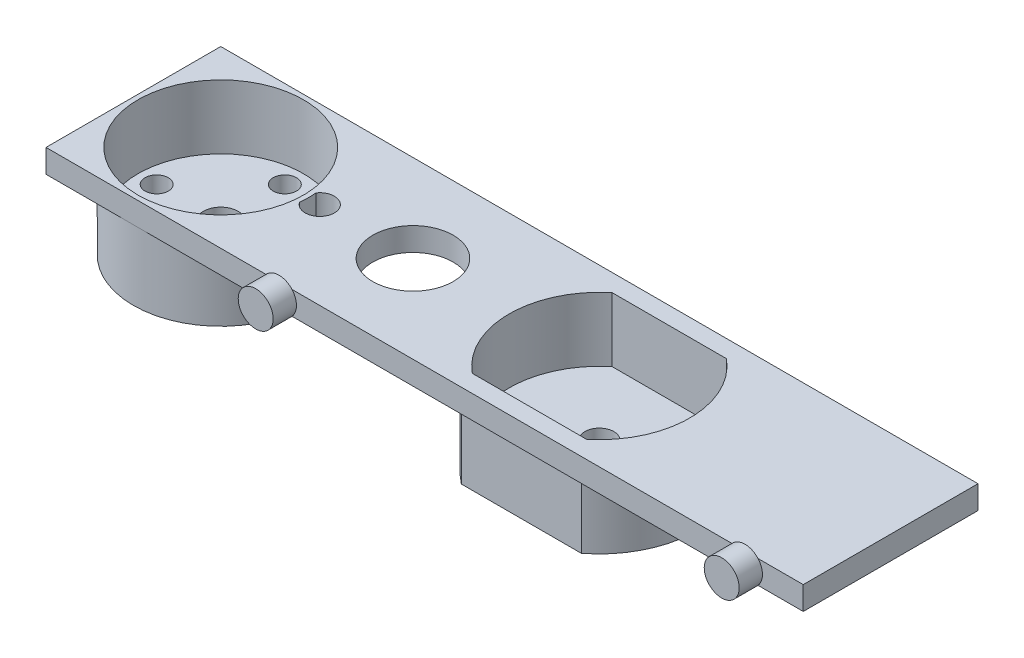
ISO-10303-21;
HEADER;
FILE_DESCRIPTION(('STEP AP214'),'2;1');
FILE_NAME('part.step','',(''),(''),'','','');
FILE_SCHEMA(('AUTOMOTIVE_DESIGN { 1 0 10303 214 1 1 1 1 }'));
ENDSEC;
DATA;
#1=APPLICATION_CONTEXT('core data for automotive mechanical design processes');
#2=APPLICATION_PROTOCOL_DEFINITION('international standard','automotive_design',2000,#1);
#3=PRODUCT_CONTEXT('',#1,'mechanical');
#4=PRODUCT('Part','Part','',(#3));
#5=PRODUCT_RELATED_PRODUCT_CATEGORY('part','',(#4));
#6=PRODUCT_DEFINITION_FORMATION('','',#4);
#7=PRODUCT_DEFINITION_CONTEXT('part definition',#1,'design');
#8=PRODUCT_DEFINITION('design','',#6,#7);
#9=PRODUCT_DEFINITION_SHAPE('','',#8);
#10=(LENGTH_UNIT() NAMED_UNIT(*) SI_UNIT(.MILLI.,.METRE.));
#11=(NAMED_UNIT(*) PLANE_ANGLE_UNIT() SI_UNIT($,.RADIAN.));
#12=(NAMED_UNIT(*) SI_UNIT($,.STERADIAN.) SOLID_ANGLE_UNIT());
#13=UNCERTAINTY_MEASURE_WITH_UNIT(LENGTH_MEASURE(1.E-05),#10,'distance_accuracy_value','');
#14=(GEOMETRIC_REPRESENTATION_CONTEXT(3) GLOBAL_UNCERTAINTY_ASSIGNED_CONTEXT((#13)) GLOBAL_UNIT_ASSIGNED_CONTEXT((#10,
#11,#12)) REPRESENTATION_CONTEXT('',''));
#15=CARTESIAN_POINT('',(0.,0.,0.));
#16=DIRECTION('',(0.,0.,1.));
#17=DIRECTION('',(1.,0.,0.));
#18=AXIS2_PLACEMENT_3D('',#15,#16,#17);
#19=CARTESIAN_POINT('',(0.,2.,0.));
#20=DIRECTION('',(0.,1.,0.));
#21=DIRECTION('',(0.,0.,1.));
#22=AXIS2_PLACEMENT_3D('',#19,#20,#21);
#23=PLANE('',#22);
#24=CARTESIAN_POINT('',(-24.,2.,0.));
#25=DIRECTION('',(0.,1.,0.));
#26=DIRECTION('',(0.,0.,1.));
#27=AXIS2_PLACEMENT_3D('',#24,#25,#26);
#28=CIRCLE('',#27,1.25);
#29=CARTESIAN_POINT('',(-25.0330882352941,2.,-0.703724873865407));
#30=VERTEX_POINT('',#29);
#31=CARTESIAN_POINT('',(-25.0330882352941,2.,0.703724873865419));
#32=VERTEX_POINT('',#31);
#33=EDGE_CURVE('E427',#30,#32,#28,.F.);
#34=ORIENTED_EDGE('',*,*,#33,.T.);
#35=CARTESIAN_POINT('',(-32.5,2.,0.));
#36=DIRECTION('',(0.,1.,0.));
#37=DIRECTION('',(0.,0.,1.));
#38=AXIS2_PLACEMENT_3D('',#35,#36,#37);
#39=CIRCLE('',#38,7.5);
#40=EDGE_CURVE('E354',#32,#30,#39,.T.);
#41=ORIENTED_EDGE('',*,*,#40,.T.);
#42=EDGE_LOOP('',(#34,#41));
#43=FACE_BOUND('',#42,.T.);
#44=DIRECTION('',(0.,0.,-1.));
#45=VECTOR('',#44,1.);
#46=CARTESIAN_POINT('',(-40.,2.,0.));
#47=LINE('',#46,#45);
#48=CARTESIAN_POINT('',(-40.,2.,7.5));
#49=VERTEX_POINT('',#48);
#50=CARTESIAN_POINT('',(-40.,2.,-7.5));
#51=VERTEX_POINT('',#50);
#52=EDGE_CURVE('E443',#49,#51,#47,.T.);
#53=ORIENTED_EDGE('',*,*,#52,.F.);
#54=DIRECTION('',(-1.,0.,0.));
#55=VECTOR('',#54,1.);
#56=CARTESIAN_POINT('',(0.,2.,7.5));
#57=LINE('',#56,#55);
#58=CARTESIAN_POINT('',(-21.1180339887499,2.,7.5));
#59=VERTEX_POINT('',#58);
#60=EDGE_CURVE('E447',#59,#49,#57,.T.);
#61=ORIENTED_EDGE('',*,*,#60,.F.);
#62=CARTESIAN_POINT('',(-18.8819660112501,2.,7.5));
#63=VERTEX_POINT('',#62);
#64=EDGE_CURVE('E714',#63,#59,#57,.T.);
#65=ORIENTED_EDGE('',*,*,#64,.F.);
#66=CARTESIAN_POINT('',(18.8819660112501,2.,7.5));
#67=VERTEX_POINT('',#66);
#68=EDGE_CURVE('E710',#67,#63,#57,.T.);
#69=ORIENTED_EDGE('',*,*,#68,.F.);
#70=CARTESIAN_POINT('',(21.1180339887499,2.,7.5));
#71=VERTEX_POINT('',#70);
#72=EDGE_CURVE('E453',#71,#67,#57,.T.);
#73=ORIENTED_EDGE('',*,*,#72,.F.);
#74=CARTESIAN_POINT('',(25.,2.,7.5));
#75=VERTEX_POINT('',#74);
#76=EDGE_CURVE('E449',#75,#71,#57,.T.);
#77=ORIENTED_EDGE('',*,*,#76,.F.);
#78=DIRECTION('',(0.,0.,1.));
#79=VECTOR('',#78,1.);
#80=CARTESIAN_POINT('',(25.,2.,-7.5));
#81=LINE('',#80,#79);
#82=CARTESIAN_POINT('',(25.,2.,-7.5));
#83=VERTEX_POINT('',#82);
#84=EDGE_CURVE('E479',#83,#75,#81,.T.);
#85=ORIENTED_EDGE('',*,*,#84,.F.);
#86=DIRECTION('',(-1.,0.,0.));
#87=VECTOR('',#86,1.);
#88=CARTESIAN_POINT('',(0.,2.,-7.5));
#89=LINE('',#88,#87);
#90=EDGE_CURVE('E452',#83,#51,#89,.T.);
#91=ORIENTED_EDGE('',*,*,#90,.T.);
#92=EDGE_LOOP('',(#53,#61,#65,#69,#73,#77,#85,#91));
#93=FACE_BOUND('',#92,.T.);
#94=CARTESIAN_POINT('',(-16.,2.,0.));
#95=DIRECTION('',(0.,1.,0.));
#96=DIRECTION('',(0.,0.,1.));
#97=AXIS2_PLACEMENT_3D('',#94,#95,#96);
#98=CIRCLE('',#97,3.45);
#99=CARTESIAN_POINT('',(-16.,2.,3.45));
#100=VERTEX_POINT('',#99);
#101=EDGE_CURVE('E411',#100,#100,#98,.F.);
#102=ORIENTED_EDGE('',*,*,#101,.T.);
#103=EDGE_LOOP('',(#102));
#104=FACE_BOUND('',#103,.T.);
#105=CARTESIAN_POINT('',(-32.5,2.,0.));
#106=DIRECTION('',(0.,1.,0.));
#107=DIRECTION('',(0.,0.,1.));
#108=AXIS2_PLACEMENT_3D('',#105,#106,#107);
#109=CIRCLE('',#108,7.1);
#110=CARTESIAN_POINT('',(-32.5,2.,7.1));
#111=VERTEX_POINT('',#110);
#112=EDGE_CURVE('E266',#111,#111,#109,.T.);
#113=ORIENTED_EDGE('',*,*,#112,.F.);
#114=EDGE_LOOP('',(#113));
#115=FACE_BOUND('',#114,.T.);
#116=CARTESIAN_POINT('',(0.,2.,0.));
#117=DIRECTION('',(0.,1.,0.));
#118=DIRECTION('',(0.,0.,1.));
#119=AXIS2_PLACEMENT_3D('',#116,#117,#118);
#120=CIRCLE('',#119,7.75);
#121=CARTESIAN_POINT('',(4.90535421758714,2.,6.));
#122=VERTEX_POINT('',#121);
#123=CARTESIAN_POINT('',(4.90535421758714,2.,-6.));
#124=VERTEX_POINT('',#123);
#125=EDGE_CURVE('E293',#122,#124,#120,.T.);
#126=ORIENTED_EDGE('',*,*,#125,.F.);
#127=DIRECTION('',(-1.,0.,0.));
#128=VECTOR('',#127,1.);
#129=CARTESIAN_POINT('',(0.,2.,6.));
#130=LINE('',#129,#128);
#131=CARTESIAN_POINT('',(-4.90535421758714,2.,6.));
#132=VERTEX_POINT('',#131);
#133=EDGE_CURVE('E138',#122,#132,#130,.T.);
#134=ORIENTED_EDGE('',*,*,#133,.T.);
#135=CARTESIAN_POINT('',(0.,2.,0.));
#136=DIRECTION('',(0.,1.,0.));
#137=DIRECTION('',(0.,0.,1.));
#138=AXIS2_PLACEMENT_3D('',#135,#136,#137);
#139=CIRCLE('',#138,7.75);
#140=CARTESIAN_POINT('',(-4.90535421758714,2.,-6.));
#141=VERTEX_POINT('',#140);
#142=EDGE_CURVE('E279',#141,#132,#139,.T.);
#143=ORIENTED_EDGE('',*,*,#142,.F.);
#144=DIRECTION('',(-1.,0.,0.));
#145=VECTOR('',#144,1.);
#146=CARTESIAN_POINT('',(0.,2.,-6.));
#147=LINE('',#146,#145);
#148=EDGE_CURVE('E573',#124,#141,#147,.T.);
#149=ORIENTED_EDGE('',*,*,#148,.F.);
#150=EDGE_LOOP('',(#126,#134,#143,#149));
#151=FACE_BOUND('',#150,.T.);
#152=ADVANCED_FACE('F121',(#43,#93,#104,#115,#151),#23,.T.);
#153=CARTESIAN_POINT('',(-38.,11.7580735803744,0.));
#154=DIRECTION('',(0.,-1.,0.));
#155=DIRECTION('',(0.,0.,-1.));
#156=AXIS2_PLACEMENT_3D('',#153,#154,#155);
#157=CYLINDRICAL_SURFACE('',#156,0.999999999999991);
#158=CARTESIAN_POINT('',(-38.,-6.,0.));
#159=DIRECTION('',(0.,1.,0.));
#160=DIRECTION('',(0.,0.,1.));
#161=AXIS2_PLACEMENT_3D('',#158,#159,#160);
#162=CIRCLE('',#161,0.999999999999991);
#163=CARTESIAN_POINT('',(-38.,-6.,0.999999999999992));
#164=VERTEX_POINT('',#163);
#165=EDGE_CURVE('E342',#164,#164,#162,.T.);
#166=ORIENTED_EDGE('',*,*,#165,.F.);
#167=EDGE_LOOP('',(#166));
#168=FACE_BOUND('',#167,.T.);
#169=CARTESIAN_POINT('',(-38.,-3.5,0.));
#170=DIRECTION('',(0.,1.,0.));
#171=DIRECTION('',(0.,0.,1.));
#172=AXIS2_PLACEMENT_3D('',#169,#170,#171);
#173=CIRCLE('',#172,0.999999999999991);
#174=CARTESIAN_POINT('',(-38.,-3.5,0.999999999999992));
#175=VERTEX_POINT('',#174);
#176=EDGE_CURVE('E320',#175,#175,#173,.T.);
#177=ORIENTED_EDGE('',*,*,#176,.T.);
#178=EDGE_LOOP('',(#177));
#179=FACE_BOUND('',#178,.T.);
#180=ADVANCED_FACE('F562',(#168,#179),#157,.F.);
#181=CARTESIAN_POINT('',(-32.5,11.7580735803744,0.));
#182=DIRECTION('',(0.,-1.,0.));
#183=DIRECTION('',(0.,0.,-1.));
#184=AXIS2_PLACEMENT_3D('',#181,#182,#183);
#185=CYLINDRICAL_SURFACE('',#184,1.5);
#186=CARTESIAN_POINT('',(-32.5,-6.,0.));
#187=DIRECTION('',(0.,1.,0.));
#188=DIRECTION('',(0.,0.,1.));
#189=AXIS2_PLACEMENT_3D('',#186,#187,#188);
#190=CIRCLE('',#189,1.5);
#191=CARTESIAN_POINT('',(-32.5,-6.,1.50000000000001));
#192=VERTEX_POINT('',#191);
#193=EDGE_CURVE('E338',#192,#192,#190,.T.);
#194=ORIENTED_EDGE('',*,*,#193,.F.);
#195=EDGE_LOOP('',(#194));
#196=FACE_BOUND('',#195,.T.);
#197=CARTESIAN_POINT('',(-32.5,-3.5,0.));
#198=DIRECTION('',(0.,1.,0.));
#199=DIRECTION('',(0.,0.,1.));
#200=AXIS2_PLACEMENT_3D('',#197,#198,#199);
#201=CIRCLE('',#200,1.5);
#202=CARTESIAN_POINT('',(-32.5,-3.5,1.50000000000001));
#203=VERTEX_POINT('',#202);
#204=EDGE_CURVE('E316',#203,#203,#201,.T.);
#205=ORIENTED_EDGE('',*,*,#204,.T.);
#206=EDGE_LOOP('',(#205));
#207=FACE_BOUND('',#206,.T.);
#208=ADVANCED_FACE('F665',(#196,#207),#185,.F.);
#209=CARTESIAN_POINT('',(-32.5,11.7580735803744,5.5));
#210=DIRECTION('',(0.,-1.,0.));
#211=DIRECTION('',(0.,0.,-1.));
#212=AXIS2_PLACEMENT_3D('',#209,#210,#211);
#213=CYLINDRICAL_SURFACE('',#212,0.999999999999998);
#214=CARTESIAN_POINT('',(-32.5,-6.,5.5));
#215=DIRECTION('',(0.,1.,0.));
#216=DIRECTION('',(0.,0.,1.));
#217=AXIS2_PLACEMENT_3D('',#214,#215,#216);
#218=CIRCLE('',#217,0.999999999999998);
#219=CARTESIAN_POINT('',(-32.5,-6.,6.5));
#220=VERTEX_POINT('',#219);
#221=EDGE_CURVE('E324',#220,#220,#218,.T.);
#222=ORIENTED_EDGE('',*,*,#221,.F.);
#223=EDGE_LOOP('',(#222));
#224=FACE_BOUND('',#223,.T.);
#225=CARTESIAN_POINT('',(-32.5,-3.5,5.5));
#226=DIRECTION('',(0.,1.,0.));
#227=DIRECTION('',(0.,0.,1.));
#228=AXIS2_PLACEMENT_3D('',#225,#226,#227);
#229=CIRCLE('',#228,0.999999999999998);
#230=CARTESIAN_POINT('',(-32.5,-3.5,6.5));
#231=VERTEX_POINT('',#230);
#232=EDGE_CURVE('E312',#231,#231,#229,.T.);
#233=ORIENTED_EDGE('',*,*,#232,.T.);
#234=EDGE_LOOP('',(#233));
#235=FACE_BOUND('',#234,.T.);
#236=ADVANCED_FACE('F661',(#224,#235),#213,.F.);
#237=CARTESIAN_POINT('',(-27.,11.7580735803744,0.));
#238=DIRECTION('',(0.,-1.,0.));
#239=DIRECTION('',(0.,0.,-1.));
#240=AXIS2_PLACEMENT_3D('',#237,#238,#239);
#241=CYLINDRICAL_SURFACE('',#240,0.999999999999998);
#242=CARTESIAN_POINT('',(-27.,-6.,0.));
#243=DIRECTION('',(0.,1.,0.));
#244=DIRECTION('',(0.,0.,1.));
#245=AXIS2_PLACEMENT_3D('',#242,#243,#244);
#246=CIRCLE('',#245,0.999999999999998);
#247=CARTESIAN_POINT('',(-27.,-6.,0.999999999999999));
#248=VERTEX_POINT('',#247);
#249=EDGE_CURVE('E334',#248,#248,#246,.T.);
#250=ORIENTED_EDGE('',*,*,#249,.F.);
#251=EDGE_LOOP('',(#250));
#252=FACE_BOUND('',#251,.T.);
#253=CARTESIAN_POINT('',(-27.,-3.5,0.));
#254=DIRECTION('',(0.,1.,0.));
#255=DIRECTION('',(0.,0.,1.));
#256=AXIS2_PLACEMENT_3D('',#253,#254,#255);
#257=CIRCLE('',#256,0.999999999999998);
#258=CARTESIAN_POINT('',(-27.,-3.5,0.999999999999999));
#259=VERTEX_POINT('',#258);
#260=EDGE_CURVE('E308',#259,#259,#257,.T.);
#261=ORIENTED_EDGE('',*,*,#260,.T.);
#262=EDGE_LOOP('',(#261));
#263=FACE_BOUND('',#262,.T.);
#264=ADVANCED_FACE('F664',(#252,#263),#241,.F.);
#265=CARTESIAN_POINT('',(-32.5,11.7580735803744,-5.5));
#266=DIRECTION('',(0.,-1.,0.));
#267=DIRECTION('',(0.,0.,-1.));
#268=AXIS2_PLACEMENT_3D('',#265,#266,#267);
#269=CYLINDRICAL_SURFACE('',#268,0.999999999999991);
#270=CARTESIAN_POINT('',(-32.5,-6.,-5.5));
#271=DIRECTION('',(0.,1.,0.));
#272=DIRECTION('',(0.,0.,1.));
#273=AXIS2_PLACEMENT_3D('',#270,#271,#272);
#274=CIRCLE('',#273,0.999999999999991);
#275=CARTESIAN_POINT('',(-32.5,-6.,-4.50000000000001));
#276=VERTEX_POINT('',#275);
#277=EDGE_CURVE('E330',#276,#276,#274,.T.);
#278=ORIENTED_EDGE('',*,*,#277,.F.);
#279=EDGE_LOOP('',(#278));
#280=FACE_BOUND('',#279,.T.);
#281=CARTESIAN_POINT('',(-32.5,-3.5,-5.5));
#282=DIRECTION('',(0.,1.,0.));
#283=DIRECTION('',(0.,0.,1.));
#284=AXIS2_PLACEMENT_3D('',#281,#282,#283);
#285=CIRCLE('',#284,0.999999999999991);
#286=CARTESIAN_POINT('',(-32.5,-3.5,-4.50000000000001));
#287=VERTEX_POINT('',#286);
#288=EDGE_CURVE('E125',#287,#287,#285,.T.);
#289=ORIENTED_EDGE('',*,*,#288,.T.);
#290=EDGE_LOOP('',(#289));
#291=FACE_BOUND('',#290,.T.);
#292=ADVANCED_FACE('F587',(#280,#291),#269,.F.);
#293=CARTESIAN_POINT('',(0.,11.7580735803744,0.));
#294=DIRECTION('',(0.,-1.,0.));
#295=DIRECTION('',(0.,0.,-1.));
#296=AXIS2_PLACEMENT_3D('',#293,#294,#295);
#297=CYLINDRICAL_SURFACE('',#296,1.25);
#298=CARTESIAN_POINT('',(0.,-6.,0.));
#299=DIRECTION('',(0.,1.,0.));
#300=DIRECTION('',(0.,0.,1.));
#301=AXIS2_PLACEMENT_3D('',#298,#299,#300);
#302=CIRCLE('',#301,1.25);
#303=CARTESIAN_POINT('',(0.,-6.,1.25));
#304=VERTEX_POINT('',#303);
#305=EDGE_CURVE('E325',#304,#304,#302,.T.);
#306=ORIENTED_EDGE('',*,*,#305,.F.);
#307=EDGE_LOOP('',(#306));
#308=FACE_BOUND('',#307,.T.);
#309=CARTESIAN_POINT('',(0.,-3.5,0.));
#310=DIRECTION('',(0.,1.,0.));
#311=DIRECTION('',(0.,0.,1.));
#312=AXIS2_PLACEMENT_3D('',#309,#310,#311);
#313=CIRCLE('',#312,1.25);
#314=CARTESIAN_POINT('',(0.,-3.5,1.25));
#315=VERTEX_POINT('',#314);
#316=EDGE_CURVE('E275',#315,#315,#313,.T.);
#317=ORIENTED_EDGE('',*,*,#316,.T.);
#318=EDGE_LOOP('',(#317));
#319=FACE_BOUND('',#318,.T.);
#320=ADVANCED_FACE('F657',(#308,#319),#297,.F.);
#321=CARTESIAN_POINT('',(0.,0.,0.));
#322=DIRECTION('',(0.,1.,0.));
#323=DIRECTION('',(0.,0.,1.));
#324=AXIS2_PLACEMENT_3D('',#321,#322,#323);
#325=PLANE('',#324);
#326=DIRECTION('',(1.,0.,0.));
#327=VECTOR('',#326,1.);
#328=CARTESIAN_POINT('',(0.,0.,6.7));
#329=LINE('',#328,#327);
#330=CARTESIAN_POINT('',(-5.14902903468217,0.,6.7));
#331=VERTEX_POINT('',#330);
#332=CARTESIAN_POINT('',(5.14902903468217,0.,6.7));
#333=VERTEX_POINT('',#332);
#334=EDGE_CURVE('E398',#331,#333,#329,.T.);
#335=ORIENTED_EDGE('',*,*,#334,.T.);
#336=CARTESIAN_POINT('',(0.,0.,0.));
#337=DIRECTION('',(0.,1.,0.));
#338=DIRECTION('',(0.,0.,1.));
#339=AXIS2_PLACEMENT_3D('',#336,#337,#338);
#340=CIRCLE('',#339,8.45);
#341=CARTESIAN_POINT('',(5.14902903468217,0.,-6.7));
#342=VERTEX_POINT('',#341);
#343=EDGE_CURVE('E402',#333,#342,#340,.T.);
#344=ORIENTED_EDGE('',*,*,#343,.T.);
#345=DIRECTION('',(-1.,0.,0.));
#346=VECTOR('',#345,1.);
#347=CARTESIAN_POINT('',(0.,0.,-6.7));
#348=LINE('',#347,#346);
#349=CARTESIAN_POINT('',(-5.14902903468217,0.,-6.7));
#350=VERTEX_POINT('',#349);
#351=EDGE_CURVE('E390',#342,#350,#348,.T.);
#352=ORIENTED_EDGE('',*,*,#351,.T.);
#353=CARTESIAN_POINT('',(0.,0.,0.));
#354=DIRECTION('',(0.,1.,0.));
#355=DIRECTION('',(0.,0.,1.));
#356=AXIS2_PLACEMENT_3D('',#353,#354,#355);
#357=CIRCLE('',#356,8.45);
#358=EDGE_CURVE('E394',#350,#331,#357,.T.);
#359=ORIENTED_EDGE('',*,*,#358,.T.);
#360=EDGE_LOOP('',(#335,#344,#352,#359));
#361=FACE_BOUND('',#360,.T.);
#362=CARTESIAN_POINT('',(-16.,0.,0.));
#363=DIRECTION('',(0.,-1.,0.));
#364=DIRECTION('',(0.,0.,-1.));
#365=AXIS2_PLACEMENT_3D('',#362,#363,#364);
#366=CIRCLE('',#365,3.45);
#367=CARTESIAN_POINT('',(-16.,0.,-3.45));
#368=VERTEX_POINT('',#367);
#369=EDGE_CURVE('E432',#368,#368,#366,.T.);
#370=ORIENTED_EDGE('',*,*,#369,.F.);
#371=EDGE_LOOP('',(#370));
#372=FACE_BOUND('',#371,.T.);
#373=DIRECTION('',(-1.,0.,0.));
#374=VECTOR('',#373,1.);
#375=CARTESIAN_POINT('',(0.,0.,7.5));
#376=LINE('',#375,#374);
#377=CARTESIAN_POINT('',(-21.1180339887499,0.,7.5));
#378=VERTEX_POINT('',#377);
#379=CARTESIAN_POINT('',(-32.5,0.,7.5));
#380=VERTEX_POINT('',#379);
#381=EDGE_CURVE('E523',#378,#380,#376,.T.);
#382=ORIENTED_EDGE('',*,*,#381,.T.);
#383=CARTESIAN_POINT('',(-32.5,0.,0.));
#384=DIRECTION('',(0.,1.,0.));
#385=DIRECTION('',(0.,0.,1.));
#386=AXIS2_PLACEMENT_3D('',#383,#384,#385);
#387=CIRCLE('',#386,7.5);
#388=CARTESIAN_POINT('',(-25.0330882352941,0.,0.703724873865416));
#389=VERTEX_POINT('',#388);
#390=EDGE_CURVE('E353',#380,#389,#387,.T.);
#391=ORIENTED_EDGE('',*,*,#390,.T.);
#392=CARTESIAN_POINT('',(-24.,0.,0.));
#393=DIRECTION('',(0.,-1.,0.));
#394=DIRECTION('',(0.,0.,-1.));
#395=AXIS2_PLACEMENT_3D('',#392,#393,#394);
#396=CIRCLE('',#395,1.25);
#397=CARTESIAN_POINT('',(-25.0330882352941,0.,-0.703724873865404));
#398=VERTEX_POINT('',#397);
#399=EDGE_CURVE('E431',#398,#389,#396,.T.);
#400=ORIENTED_EDGE('',*,*,#399,.F.);
#401=CARTESIAN_POINT('',(-32.5,0.,-7.5));
#402=VERTEX_POINT('',#401);
#403=EDGE_CURVE('E388',#398,#402,#387,.T.);
#404=ORIENTED_EDGE('',*,*,#403,.T.);
#405=DIRECTION('',(-1.,0.,0.));
#406=VECTOR('',#405,1.);
#407=CARTESIAN_POINT('',(0.,0.,-7.5));
#408=LINE('',#407,#406);
#409=CARTESIAN_POINT('',(25.,0.,-7.5));
#410=VERTEX_POINT('',#409);
#411=EDGE_CURVE('E448',#410,#402,#408,.T.);
#412=ORIENTED_EDGE('',*,*,#411,.F.);
#413=DIRECTION('',(0.,0.,1.));
#414=VECTOR('',#413,1.);
#415=CARTESIAN_POINT('',(25.,0.,-7.5));
#416=LINE('',#415,#414);
#417=CARTESIAN_POINT('',(25.,0.,7.5));
#418=VERTEX_POINT('',#417);
#419=EDGE_CURVE('E436',#410,#418,#416,.T.);
#420=ORIENTED_EDGE('',*,*,#419,.T.);
#421=CARTESIAN_POINT('',(21.1180339887499,0.,7.5));
#422=VERTEX_POINT('',#421);
#423=EDGE_CURVE('E463',#418,#422,#376,.T.);
#424=ORIENTED_EDGE('',*,*,#423,.T.);
#425=CARTESIAN_POINT('',(18.8819660112501,0.,7.5));
#426=VERTEX_POINT('',#425);
#427=EDGE_CURVE('E468',#422,#426,#376,.T.);
#428=ORIENTED_EDGE('',*,*,#427,.T.);
#429=CARTESIAN_POINT('',(-18.8819660112501,0.,7.5));
#430=VERTEX_POINT('',#429);
#431=EDGE_CURVE('E517',#426,#430,#376,.T.);
#432=ORIENTED_EDGE('',*,*,#431,.T.);
#433=EDGE_CURVE('E519',#430,#378,#376,.T.);
#434=ORIENTED_EDGE('',*,*,#433,.T.);
#435=EDGE_LOOP('',(#382,#391,#400,#404,#412,#420,#424,#428,#432,#434));
#436=FACE_BOUND('',#435,.T.);
#437=ADVANCED_FACE('F555',(#361,#372,#436),#325,.F.);
#438=CARTESIAN_POINT('',(-40.,0.,-7.5));
#439=VERTEX_POINT('',#438);
#440=EDGE_CURVE('E467',#402,#439,#408,.T.);
#441=ORIENTED_EDGE('',*,*,#440,.F.);
#442=CARTESIAN_POINT('',(-40.,0.,0.));
#443=VERTEX_POINT('',#442);
#444=EDGE_CURVE('E389',#402,#443,#387,.T.);
#445=ORIENTED_EDGE('',*,*,#444,.T.);
#446=DIRECTION('',(0.,0.,-1.));
#447=VECTOR('',#446,1.);
#448=CARTESIAN_POINT('',(-40.,0.,0.));
#449=LINE('',#448,#447);
#450=EDGE_CURVE('E462',#443,#439,#449,.T.);
#451=ORIENTED_EDGE('',*,*,#450,.T.);
#452=EDGE_LOOP('',(#441,#445,#451));
#453=FACE_BOUND('',#452,.T.);
#454=ADVANCED_FACE('F548',(#453),#325,.F.);
#455=CARTESIAN_POINT('',(0.,2.,7.5));
#456=DIRECTION('',(0.,0.,1.));
#457=DIRECTION('',(1.,0.,0.));
#458=AXIS2_PLACEMENT_3D('',#455,#456,#457);
#459=PLANE('',#458);
#460=CARTESIAN_POINT('',(20.,0.999999999999999,7.5));
#461=DIRECTION('',(0.,0.,1.));
#462=DIRECTION('',(1.,0.,0.));
#463=AXIS2_PLACEMENT_3D('',#460,#461,#462);
#464=CIRCLE('',#463,1.5);
#465=EDGE_CURVE('E496',#67,#426,#464,.T.);
#466=ORIENTED_EDGE('',*,*,#465,.F.);
#467=ORIENTED_EDGE('',*,*,#68,.T.);
#468=CARTESIAN_POINT('',(-20.,0.999999999999995,7.5));
#469=DIRECTION('',(0.,0.,1.));
#470=DIRECTION('',(1.,0.,0.));
#471=AXIS2_PLACEMENT_3D('',#468,#469,#470);
#472=CIRCLE('',#471,1.5);
#473=EDGE_CURVE('E423',#430,#63,#472,.T.);
#474=ORIENTED_EDGE('',*,*,#473,.F.);
#475=ORIENTED_EDGE('',*,*,#431,.F.);
#476=EDGE_LOOP('',(#466,#467,#474,#475));
#477=FACE_BOUND('',#476,.T.);
#478=ADVANCED_FACE('F694',(#477),#459,.T.);
#479=ORIENTED_EDGE('',*,*,#60,.T.);
#480=DIRECTION('',(0.,-1.,0.));
#481=VECTOR('',#480,1.);
#482=CARTESIAN_POINT('',(-40.,2.,7.5));
#483=LINE('',#482,#481);
#484=CARTESIAN_POINT('',(-40.,0.,7.5));
#485=VERTEX_POINT('',#484);
#486=EDGE_CURVE('E475',#49,#485,#483,.T.);
#487=ORIENTED_EDGE('',*,*,#486,.T.);
#488=EDGE_CURVE('E461',#380,#485,#376,.T.);
#489=ORIENTED_EDGE('',*,*,#488,.F.);
#490=ORIENTED_EDGE('',*,*,#381,.F.);
#491=EDGE_CURVE('E505',#59,#378,#472,.T.);
#492=ORIENTED_EDGE('',*,*,#491,.F.);
#493=EDGE_LOOP('',(#479,#487,#489,#490,#492));
#494=FACE_BOUND('',#493,.T.);
#495=ADVANCED_FACE('F536',(#494),#459,.T.);
#496=EDGE_CURVE('E457',#485,#443,#449,.T.);
#497=ORIENTED_EDGE('',*,*,#496,.T.);
#498=EDGE_CURVE('E533',#443,#380,#387,.T.);
#499=ORIENTED_EDGE('',*,*,#498,.T.);
#500=ORIENTED_EDGE('',*,*,#488,.T.);
#501=EDGE_LOOP('',(#497,#499,#500));
#502=FACE_BOUND('',#501,.T.);
#503=ADVANCED_FACE('F531',(#502),#325,.F.);
#504=CARTESIAN_POINT('',(0.,2.,-7.5));
#505=DIRECTION('',(0.,0.,1.));
#506=DIRECTION('',(1.,0.,0.));
#507=AXIS2_PLACEMENT_3D('',#504,#505,#506);
#508=PLANE('',#507);
#509=ORIENTED_EDGE('',*,*,#411,.T.);
#510=ORIENTED_EDGE('',*,*,#440,.T.);
#511=DIRECTION('',(0.,-1.,0.));
#512=VECTOR('',#511,1.);
#513=CARTESIAN_POINT('',(-40.,2.,-7.5));
#514=LINE('',#513,#512);
#515=EDGE_CURVE('E456',#51,#439,#514,.T.);
#516=ORIENTED_EDGE('',*,*,#515,.F.);
#517=ORIENTED_EDGE('',*,*,#90,.F.);
#518=DIRECTION('',(0.,-1.,0.));
#519=VECTOR('',#518,1.);
#520=CARTESIAN_POINT('',(25.,2.,-7.5));
#521=LINE('',#520,#519);
#522=EDGE_CURVE('E483',#83,#410,#521,.T.);
#523=ORIENTED_EDGE('',*,*,#522,.T.);
#524=EDGE_LOOP('',(#509,#510,#516,#517,#523));
#525=FACE_BOUND('',#524,.T.);
#526=ADVANCED_FACE('F687',(#525),#508,.F.);
#527=EDGE_CURVE('E417',#422,#71,#464,.T.);
#528=ORIENTED_EDGE('',*,*,#527,.F.);
#529=ORIENTED_EDGE('',*,*,#423,.F.);
#530=DIRECTION('',(0.,-1.,0.));
#531=VECTOR('',#530,1.);
#532=CARTESIAN_POINT('',(25.,2.,7.5));
#533=LINE('',#532,#531);
#534=EDGE_CURVE('E490',#75,#418,#533,.T.);
#535=ORIENTED_EDGE('',*,*,#534,.F.);
#536=ORIENTED_EDGE('',*,*,#76,.T.);
#537=EDGE_LOOP('',(#528,#529,#535,#536));
#538=FACE_BOUND('',#537,.T.);
#539=ADVANCED_FACE('F690',(#538),#459,.T.);
#540=CARTESIAN_POINT('',(-40.,2.,0.));
#541=DIRECTION('',(-1.,0.,0.));
#542=DIRECTION('',(0.,0.,1.));
#543=AXIS2_PLACEMENT_3D('',#540,#541,#542);
#544=PLANE('',#543);
#545=ORIENTED_EDGE('',*,*,#52,.T.);
#546=ORIENTED_EDGE('',*,*,#515,.T.);
#547=ORIENTED_EDGE('',*,*,#450,.F.);
#548=ORIENTED_EDGE('',*,*,#496,.F.);
#549=ORIENTED_EDGE('',*,*,#486,.F.);
#550=EDGE_LOOP('',(#545,#546,#547,#548,#549));
#551=FACE_BOUND('',#550,.T.);
#552=ADVANCED_FACE('F541',(#551),#544,.T.);
#553=CARTESIAN_POINT('',(25.,2.,-7.5));
#554=DIRECTION('',(1.,0.,0.));
#555=DIRECTION('',(0.,0.,-1.));
#556=AXIS2_PLACEMENT_3D('',#553,#554,#555);
#557=PLANE('',#556);
#558=ORIENTED_EDGE('',*,*,#419,.F.);
#559=ORIENTED_EDGE('',*,*,#522,.F.);
#560=ORIENTED_EDGE('',*,*,#84,.T.);
#561=ORIENTED_EDGE('',*,*,#534,.T.);
#562=EDGE_LOOP('',(#558,#559,#560,#561));
#563=FACE_BOUND('',#562,.T.);
#564=ADVANCED_FACE('F123',(#563),#557,.T.);
#565=CARTESIAN_POINT('',(-24.,11.7580735803744,0.));
#566=DIRECTION('',(0.,-1.,0.));
#567=DIRECTION('',(0.,0.,-1.));
#568=AXIS2_PLACEMENT_3D('',#565,#566,#567);
#569=CYLINDRICAL_SURFACE('',#568,1.25);
#570=ORIENTED_EDGE('',*,*,#33,.F.);
#571=DIRECTION('',(0.,1.,0.));
#572=VECTOR('',#571,1.);
#573=CARTESIAN_POINT('',(-25.0330882352941,-2.,-0.703724873865404));
#574=LINE('',#573,#572);
#575=EDGE_CURVE('E13',#30,#398,#574,.F.);
#576=ORIENTED_EDGE('',*,*,#575,.T.);
#577=ORIENTED_EDGE('',*,*,#399,.T.);
#578=DIRECTION('',(0.,1.,0.));
#579=VECTOR('',#578,1.);
#580=CARTESIAN_POINT('',(-25.0330882352941,-2.,0.703724873865415));
#581=LINE('',#580,#579);
#582=EDGE_CURVE('E131',#389,#32,#581,.T.);
#583=ORIENTED_EDGE('',*,*,#582,.T.);
#584=EDGE_LOOP('',(#570,#576,#577,#583));
#585=FACE_BOUND('',#584,.T.);
#586=ADVANCED_FACE('F558',(#585),#569,.F.);
#587=CARTESIAN_POINT('',(-16.,11.7580735803744,0.));
#588=DIRECTION('',(0.,-1.,0.));
#589=DIRECTION('',(0.,0.,-1.));
#590=AXIS2_PLACEMENT_3D('',#587,#588,#589);
#591=CYLINDRICAL_SURFACE('',#590,3.45);
#592=ORIENTED_EDGE('',*,*,#369,.T.);
#593=EDGE_LOOP('',(#592));
#594=FACE_BOUND('',#593,.T.);
#595=ORIENTED_EDGE('',*,*,#101,.F.);
#596=EDGE_LOOP('',(#595));
#597=FACE_BOUND('',#596,.T.);
#598=ADVANCED_FACE('F675',(#594,#597),#591,.F.);
#599=CARTESIAN_POINT('',(-20.,0.999999999999995,7.5));
#600=DIRECTION('',(0.,0.,1.));
#601=DIRECTION('',(1.,0.,0.));
#602=AXIS2_PLACEMENT_3D('',#599,#600,#601);
#603=PLANE('',#602);
#604=EDGE_CURVE('E418',#63,#59,#472,.T.);
#605=ORIENTED_EDGE('',*,*,#604,.F.);
#606=ORIENTED_EDGE('',*,*,#64,.T.);
#607=EDGE_LOOP('',(#605,#606));
#608=FACE_BOUND('',#607,.T.);
#609=ADVANCED_FACE('F648',(#608),#603,.F.);
#610=CARTESIAN_POINT('',(-20.,0.999999999999995,9.5));
#611=DIRECTION('',(0.,0.,-1.));
#612=DIRECTION('',(-1.,0.,0.));
#613=AXIS2_PLACEMENT_3D('',#610,#611,#612);
#614=CYLINDRICAL_SURFACE('',#613,1.5);
#615=CARTESIAN_POINT('',(-20.,0.999999999999995,9.5));
#616=DIRECTION('',(0.,0.,1.));
#617=DIRECTION('',(1.,0.,0.));
#618=AXIS2_PLACEMENT_3D('',#615,#616,#617);
#619=CIRCLE('',#618,1.5);
#620=CARTESIAN_POINT('',(-18.5,0.999999999999995,9.5));
#621=VERTEX_POINT('',#620);
#622=EDGE_CURVE('E406',#621,#621,#619,.T.);
#623=ORIENTED_EDGE('',*,*,#622,.F.);
#624=EDGE_LOOP('',(#623));
#625=FACE_BOUND('',#624,.T.);
#626=ORIENTED_EDGE('',*,*,#604,.T.);
#627=ORIENTED_EDGE('',*,*,#491,.T.);
#628=EDGE_CURVE('E422',#378,#430,#472,.T.);
#629=ORIENTED_EDGE('',*,*,#628,.T.);
#630=ORIENTED_EDGE('',*,*,#473,.T.);
#631=EDGE_LOOP('',(#626,#627,#629,#630));
#632=FACE_BOUND('',#631,.T.);
#633=ADVANCED_FACE('F644',(#625,#632),#614,.T.);
#634=CARTESIAN_POINT('',(-20.,0.999999999999995,9.5));
#635=DIRECTION('',(0.,0.,1.));
#636=DIRECTION('',(1.,0.,0.));
#637=AXIS2_PLACEMENT_3D('',#634,#635,#636);
#638=PLANE('',#637);
#639=ORIENTED_EDGE('',*,*,#622,.T.);
#640=EDGE_LOOP('',(#639));
#641=FACE_BOUND('',#640,.T.);
#642=ADVANCED_FACE('F647',(#641),#638,.T.);
#643=ORIENTED_EDGE('',*,*,#433,.F.);
#644=ORIENTED_EDGE('',*,*,#628,.F.);
#645=EDGE_LOOP('',(#643,#644));
#646=FACE_BOUND('',#645,.T.);
#647=ADVANCED_FACE('F650',(#646),#603,.F.);
#648=CARTESIAN_POINT('',(20.,0.999999999999999,7.5));
#649=DIRECTION('',(0.,0.,1.));
#650=DIRECTION('',(1.,0.,0.));
#651=AXIS2_PLACEMENT_3D('',#648,#649,#650);
#652=PLANE('',#651);
#653=EDGE_CURVE('E412',#71,#67,#464,.T.);
#654=ORIENTED_EDGE('',*,*,#653,.F.);
#655=ORIENTED_EDGE('',*,*,#72,.T.);
#656=EDGE_LOOP('',(#654,#655));
#657=FACE_BOUND('',#656,.T.);
#658=ADVANCED_FACE('F640',(#657),#652,.F.);
#659=CARTESIAN_POINT('',(20.,0.999999999999999,9.5));
#660=DIRECTION('',(0.,0.,-1.));
#661=DIRECTION('',(-1.,0.,0.));
#662=AXIS2_PLACEMENT_3D('',#659,#660,#661);
#663=CYLINDRICAL_SURFACE('',#662,1.5);
#664=CARTESIAN_POINT('',(20.,0.999999999999999,9.5));
#665=DIRECTION('',(0.,0.,1.));
#666=DIRECTION('',(1.,0.,0.));
#667=AXIS2_PLACEMENT_3D('',#664,#665,#666);
#668=CIRCLE('',#667,1.5);
#669=CARTESIAN_POINT('',(21.5,0.999999999999999,9.5));
#670=VERTEX_POINT('',#669);
#671=EDGE_CURVE('E407',#670,#670,#668,.T.);
#672=ORIENTED_EDGE('',*,*,#671,.F.);
#673=EDGE_LOOP('',(#672));
#674=FACE_BOUND('',#673,.T.);
#675=ORIENTED_EDGE('',*,*,#653,.T.);
#676=ORIENTED_EDGE('',*,*,#465,.T.);
#677=EDGE_CURVE('E416',#426,#422,#464,.T.);
#678=ORIENTED_EDGE('',*,*,#677,.T.);
#679=ORIENTED_EDGE('',*,*,#527,.T.);
#680=EDGE_LOOP('',(#675,#676,#678,#679));
#681=FACE_BOUND('',#680,.T.);
#682=ADVANCED_FACE('F508',(#674,#681),#663,.T.);
#683=CARTESIAN_POINT('',(20.,0.999999999999999,9.5));
#684=DIRECTION('',(0.,0.,1.));
#685=DIRECTION('',(1.,0.,0.));
#686=AXIS2_PLACEMENT_3D('',#683,#684,#685);
#687=PLANE('',#686);
#688=ORIENTED_EDGE('',*,*,#671,.T.);
#689=EDGE_LOOP('',(#688));
#690=FACE_BOUND('',#689,.T.);
#691=ADVANCED_FACE('F634',(#690),#687,.T.);
#692=ORIENTED_EDGE('',*,*,#427,.F.);
#693=ORIENTED_EDGE('',*,*,#677,.F.);
#694=EDGE_LOOP('',(#692,#693));
#695=FACE_BOUND('',#694,.T.);
#696=ADVANCED_FACE('F512',(#695),#652,.F.);
#697=CARTESIAN_POINT('',(-32.5,-6.,0.));
#698=DIRECTION('',(0.,1.,0.));
#699=DIRECTION('',(0.,0.,1.));
#700=AXIS2_PLACEMENT_3D('',#697,#698,#699);
#701=CYLINDRICAL_SURFACE('',#700,7.5);
#702=CARTESIAN_POINT('',(-32.5,-6.,0.));
#703=DIRECTION('',(0.,1.,0.));
#704=DIRECTION('',(0.,0.,1.));
#705=AXIS2_PLACEMENT_3D('',#702,#703,#704);
#706=CIRCLE('',#705,7.5);
#707=CARTESIAN_POINT('',(-32.5,-6.,7.5));
#708=VERTEX_POINT('',#707);
#709=EDGE_CURVE('E349',#708,#708,#706,.T.);
#710=ORIENTED_EDGE('',*,*,#709,.T.);
#711=EDGE_LOOP('',(#710));
#712=FACE_BOUND('',#711,.T.);
#713=ORIENTED_EDGE('',*,*,#444,.F.);
#714=ORIENTED_EDGE('',*,*,#403,.F.);
#715=ORIENTED_EDGE('',*,*,#575,.F.);
#716=ORIENTED_EDGE('',*,*,#40,.F.);
#717=ORIENTED_EDGE('',*,*,#582,.F.);
#718=ORIENTED_EDGE('',*,*,#390,.F.);
#719=ORIENTED_EDGE('',*,*,#498,.F.);
#720=EDGE_LOOP('',(#713,#714,#715,#716,#717,#718,#719));
#721=FACE_BOUND('',#720,.T.);
#722=ADVANCED_FACE('F557',(#712,#721),#701,.T.);
#723=CARTESIAN_POINT('',(-32.5,-6.,0.));
#724=DIRECTION('',(0.,1.,0.));
#725=DIRECTION('',(0.,0.,1.));
#726=AXIS2_PLACEMENT_3D('',#723,#724,#725);
#727=PLANE('',#726);
#728=ORIENTED_EDGE('',*,*,#709,.F.);
#729=EDGE_LOOP('',(#728));
#730=FACE_BOUND('',#729,.T.);
#731=ORIENTED_EDGE('',*,*,#221,.T.);
#732=EDGE_LOOP('',(#731));
#733=FACE_BOUND('',#732,.T.);
#734=ORIENTED_EDGE('',*,*,#249,.T.);
#735=EDGE_LOOP('',(#734));
#736=FACE_BOUND('',#735,.T.);
#737=ORIENTED_EDGE('',*,*,#193,.T.);
#738=EDGE_LOOP('',(#737));
#739=FACE_BOUND('',#738,.T.);
#740=ORIENTED_EDGE('',*,*,#165,.T.);
#741=EDGE_LOOP('',(#740));
#742=FACE_BOUND('',#741,.T.);
#743=ORIENTED_EDGE('',*,*,#277,.T.);
#744=EDGE_LOOP('',(#743));
#745=FACE_BOUND('',#744,.T.);
#746=ADVANCED_FACE('F608',(#730,#733,#736,#739,#742,#745),#727,.F.);
#747=CARTESIAN_POINT('',(0.,-6.,0.));
#748=DIRECTION('',(0.,1.,0.));
#749=DIRECTION('',(0.,0.,1.));
#750=AXIS2_PLACEMENT_3D('',#747,#748,#749);
#751=CYLINDRICAL_SURFACE('',#750,8.45);
#752=ORIENTED_EDGE('',*,*,#343,.F.);
#753=DIRECTION('',(0.,1.,0.));
#754=VECTOR('',#753,1.);
#755=CARTESIAN_POINT('',(5.14902903468217,-6.,6.7));
#756=LINE('',#755,#754);
#757=CARTESIAN_POINT('',(5.14902903468217,-6.,6.7));
#758=VERTEX_POINT('',#757);
#759=EDGE_CURVE('E329',#758,#333,#756,.T.);
#760=ORIENTED_EDGE('',*,*,#759,.F.);
#761=CARTESIAN_POINT('',(0.,-6.,0.));
#762=DIRECTION('',(0.,1.,0.));
#763=DIRECTION('',(0.,0.,1.));
#764=AXIS2_PLACEMENT_3D('',#761,#762,#763);
#765=CIRCLE('',#764,8.45);
#766=CARTESIAN_POINT('',(5.14902903468217,-6.,-6.7));
#767=VERTEX_POINT('',#766);
#768=EDGE_CURVE('E357',#758,#767,#765,.T.);
#769=ORIENTED_EDGE('',*,*,#768,.T.);
#770=DIRECTION('',(0.,1.,0.));
#771=VECTOR('',#770,1.);
#772=CARTESIAN_POINT('',(5.14902903468217,-6.,-6.7));
#773=LINE('',#772,#771);
#774=EDGE_CURVE('E358',#767,#342,#773,.T.);
#775=ORIENTED_EDGE('',*,*,#774,.T.);
#776=EDGE_LOOP('',(#752,#760,#769,#775));
#777=FACE_BOUND('',#776,.T.);
#778=ADVANCED_FACE('F611',(#777),#751,.T.);
#779=CARTESIAN_POINT('',(5.14902903468217,-6.,6.7));
#780=DIRECTION('',(0.,0.,1.));
#781=DIRECTION('',(1.,0.,0.));
#782=AXIS2_PLACEMENT_3D('',#779,#780,#781);
#783=PLANE('',#782);
#784=ORIENTED_EDGE('',*,*,#334,.F.);
#785=DIRECTION('',(0.,1.,0.));
#786=VECTOR('',#785,1.);
#787=CARTESIAN_POINT('',(-5.14902903468217,-6.,6.7));
#788=LINE('',#787,#786);
#789=CARTESIAN_POINT('',(-5.14902903468217,-6.,6.7));
#790=VERTEX_POINT('',#789);
#791=EDGE_CURVE('E365',#790,#331,#788,.T.);
#792=ORIENTED_EDGE('',*,*,#791,.F.);
#793=DIRECTION('',(1.,0.,0.));
#794=VECTOR('',#793,1.);
#795=CARTESIAN_POINT('',(5.14902903468217,-6.,6.7));
#796=LINE('',#795,#794);
#797=EDGE_CURVE('E362',#790,#758,#796,.T.);
#798=ORIENTED_EDGE('',*,*,#797,.T.);
#799=ORIENTED_EDGE('',*,*,#759,.T.);
#800=EDGE_LOOP('',(#784,#792,#798,#799));
#801=FACE_BOUND('',#800,.T.);
#802=ADVANCED_FACE('F618',(#801),#783,.T.);
#803=CARTESIAN_POINT('',(0.,-6.,0.));
#804=DIRECTION('',(0.,1.,0.));
#805=DIRECTION('',(0.,0.,1.));
#806=AXIS2_PLACEMENT_3D('',#803,#804,#805);
#807=CYLINDRICAL_SURFACE('',#806,8.45);
#808=ORIENTED_EDGE('',*,*,#358,.F.);
#809=DIRECTION('',(0.,1.,0.));
#810=VECTOR('',#809,1.);
#811=CARTESIAN_POINT('',(-5.14902903468217,-6.,-6.7));
#812=LINE('',#811,#810);
#813=CARTESIAN_POINT('',(-5.14902903468217,-6.,-6.7));
#814=VERTEX_POINT('',#813);
#815=EDGE_CURVE('E146',#814,#350,#812,.T.);
#816=ORIENTED_EDGE('',*,*,#815,.F.);
#817=CARTESIAN_POINT('',(0.,-6.,0.));
#818=DIRECTION('',(0.,1.,0.));
#819=DIRECTION('',(0.,0.,1.));
#820=AXIS2_PLACEMENT_3D('',#817,#818,#819);
#821=CIRCLE('',#820,8.45);
#822=EDGE_CURVE('E375',#814,#790,#821,.T.);
#823=ORIENTED_EDGE('',*,*,#822,.T.);
#824=ORIENTED_EDGE('',*,*,#791,.T.);
#825=EDGE_LOOP('',(#808,#816,#823,#824));
#826=FACE_BOUND('',#825,.T.);
#827=ADVANCED_FACE('F624',(#826),#807,.T.);
#828=CARTESIAN_POINT('',(5.14902903468217,-6.,-6.7));
#829=DIRECTION('',(0.,0.,-1.));
#830=DIRECTION('',(-1.,0.,0.));
#831=AXIS2_PLACEMENT_3D('',#828,#829,#830);
#832=PLANE('',#831);
#833=ORIENTED_EDGE('',*,*,#351,.F.);
#834=ORIENTED_EDGE('',*,*,#774,.F.);
#835=DIRECTION('',(-1.,0.,0.));
#836=VECTOR('',#835,1.);
#837=CARTESIAN_POINT('',(5.14902903468217,-6.,-6.7));
#838=LINE('',#837,#836);
#839=EDGE_CURVE('E379',#767,#814,#838,.T.);
#840=ORIENTED_EDGE('',*,*,#839,.T.);
#841=ORIENTED_EDGE('',*,*,#815,.T.);
#842=EDGE_LOOP('',(#833,#834,#840,#841));
#843=FACE_BOUND('',#842,.T.);
#844=ADVANCED_FACE('F620',(#843),#832,.T.);
#845=CARTESIAN_POINT('',(0.,-6.,0.));
#846=DIRECTION('',(0.,1.,0.));
#847=DIRECTION('',(0.,0.,1.));
#848=AXIS2_PLACEMENT_3D('',#845,#846,#847);
#849=PLANE('',#848);
#850=ORIENTED_EDGE('',*,*,#768,.F.);
#851=ORIENTED_EDGE('',*,*,#797,.F.);
#852=ORIENTED_EDGE('',*,*,#822,.F.);
#853=ORIENTED_EDGE('',*,*,#839,.F.);
#854=EDGE_LOOP('',(#850,#851,#852,#853));
#855=FACE_BOUND('',#854,.T.);
#856=ORIENTED_EDGE('',*,*,#305,.T.);
#857=EDGE_LOOP('',(#856));
#858=FACE_BOUND('',#857,.T.);
#859=ADVANCED_FACE('F623',(#855,#858),#849,.F.);
#860=CARTESIAN_POINT('',(0.,-26.0818325856979,6.));
#861=DIRECTION('',(0.,0.,-1.));
#862=DIRECTION('',(-1.,0.,0.));
#863=AXIS2_PLACEMENT_3D('',#860,#861,#862);
#864=PLANE('',#863);
#865=DIRECTION('',(0.,1.,0.));
#866=VECTOR('',#865,1.);
#867=CARTESIAN_POINT('',(-4.90535421758714,-26.0818325856979,6.));
#868=LINE('',#867,#866);
#869=CARTESIAN_POINT('',(-4.90535421758714,-3.5,6.));
#870=VERTEX_POINT('',#869);
#871=EDGE_CURVE('E260',#870,#132,#868,.T.);
#872=ORIENTED_EDGE('',*,*,#871,.T.);
#873=ORIENTED_EDGE('',*,*,#133,.F.);
#874=DIRECTION('',(0.,1.,0.));
#875=VECTOR('',#874,1.);
#876=CARTESIAN_POINT('',(4.90535421758714,-26.0818325856979,6.));
#877=LINE('',#876,#875);
#878=CARTESIAN_POINT('',(4.90535421758714,-3.5,6.));
#879=VERTEX_POINT('',#878);
#880=EDGE_CURVE('E262',#879,#122,#877,.T.);
#881=ORIENTED_EDGE('',*,*,#880,.F.);
#882=DIRECTION('',(1.,0.,0.));
#883=VECTOR('',#882,1.);
#884=CARTESIAN_POINT('',(0.,-3.5,6.));
#885=LINE('',#884,#883);
#886=EDGE_CURVE('E256',#870,#879,#885,.T.);
#887=ORIENTED_EDGE('',*,*,#886,.F.);
#888=EDGE_LOOP('',(#872,#873,#881,#887));
#889=FACE_BOUND('',#888,.T.);
#890=ADVANCED_FACE('F258',(#889),#864,.T.);
#891=CARTESIAN_POINT('',(0.,-26.0818325856979,0.));
#892=DIRECTION('',(0.,1.,0.));
#893=DIRECTION('',(0.,0.,1.));
#894=AXIS2_PLACEMENT_3D('',#891,#892,#893);
#895=CYLINDRICAL_SURFACE('',#894,7.75);
#896=CARTESIAN_POINT('',(0.,-3.5,0.));
#897=DIRECTION('',(0.,1.,0.));
#898=DIRECTION('',(0.,0.,1.));
#899=AXIS2_PLACEMENT_3D('',#896,#897,#898);
#900=CIRCLE('',#899,7.75);
#901=CARTESIAN_POINT('',(-4.90535421758714,-3.5,-6.));
#902=VERTEX_POINT('',#901);
#903=EDGE_CURVE('E269',#870,#902,#900,.F.);
#904=ORIENTED_EDGE('',*,*,#903,.T.);
#905=DIRECTION('',(0.,1.,0.));
#906=VECTOR('',#905,1.);
#907=CARTESIAN_POINT('',(-4.90535421758714,-26.0818325856979,-6.));
#908=LINE('',#907,#906);
#909=EDGE_CURVE('E281',#902,#141,#908,.T.);
#910=ORIENTED_EDGE('',*,*,#909,.T.);
#911=ORIENTED_EDGE('',*,*,#142,.T.);
#912=ORIENTED_EDGE('',*,*,#871,.F.);
#913=EDGE_LOOP('',(#904,#910,#911,#912));
#914=FACE_BOUND('',#913,.T.);
#915=ADVANCED_FACE('F277',(#914),#895,.F.);
#916=CARTESIAN_POINT('',(0.,-26.0818325856979,-6.));
#917=DIRECTION('',(0.,0.,-1.));
#918=DIRECTION('',(-1.,0.,0.));
#919=AXIS2_PLACEMENT_3D('',#916,#917,#918);
#920=PLANE('',#919);
#921=DIRECTION('',(1.,0.,0.));
#922=VECTOR('',#921,1.);
#923=CARTESIAN_POINT('',(0.,-3.5,-6.));
#924=LINE('',#923,#922);
#925=CARTESIAN_POINT('',(4.90535421758714,-3.50000000000001,-6.));
#926=VERTEX_POINT('',#925);
#927=EDGE_CURVE('E271',#902,#926,#924,.T.);
#928=ORIENTED_EDGE('',*,*,#927,.T.);
#929=DIRECTION('',(0.,1.,0.));
#930=VECTOR('',#929,1.);
#931=CARTESIAN_POINT('',(4.90535421758714,-26.0818325856979,-6.));
#932=LINE('',#931,#930);
#933=EDGE_CURVE('E285',#926,#124,#932,.T.);
#934=ORIENTED_EDGE('',*,*,#933,.T.);
#935=ORIENTED_EDGE('',*,*,#148,.T.);
#936=ORIENTED_EDGE('',*,*,#909,.F.);
#937=EDGE_LOOP('',(#928,#934,#935,#936));
#938=FACE_BOUND('',#937,.T.);
#939=ADVANCED_FACE('F965',(#938),#920,.F.);
#940=CARTESIAN_POINT('',(0.,-26.0818325856979,0.));
#941=DIRECTION('',(0.,1.,0.));
#942=DIRECTION('',(0.,0.,1.));
#943=AXIS2_PLACEMENT_3D('',#940,#941,#942);
#944=CYLINDRICAL_SURFACE('',#943,7.75);
#945=CARTESIAN_POINT('',(0.,-3.5,0.));
#946=DIRECTION('',(0.,1.,0.));
#947=DIRECTION('',(0.,0.,1.));
#948=AXIS2_PLACEMENT_3D('',#945,#946,#947);
#949=CIRCLE('',#948,7.75);
#950=EDGE_CURVE('E289',#926,#879,#949,.F.);
#951=ORIENTED_EDGE('',*,*,#950,.T.);
#952=ORIENTED_EDGE('',*,*,#880,.T.);
#953=ORIENTED_EDGE('',*,*,#125,.T.);
#954=ORIENTED_EDGE('',*,*,#933,.F.);
#955=EDGE_LOOP('',(#951,#952,#953,#954));
#956=FACE_BOUND('',#955,.T.);
#957=ADVANCED_FACE('F603',(#956),#944,.F.);
#958=CARTESIAN_POINT('',(0.,-3.5,0.));
#959=DIRECTION('',(0.,1.,0.));
#960=DIRECTION('',(0.,0.,1.));
#961=AXIS2_PLACEMENT_3D('',#958,#959,#960);
#962=PLANE('',#961);
#963=ORIENTED_EDGE('',*,*,#316,.F.);
#964=EDGE_LOOP('',(#963));
#965=FACE_BOUND('',#964,.T.);
#966=ORIENTED_EDGE('',*,*,#903,.F.);
#967=ORIENTED_EDGE('',*,*,#886,.T.);
#968=ORIENTED_EDGE('',*,*,#950,.F.);
#969=ORIENTED_EDGE('',*,*,#927,.F.);
#970=EDGE_LOOP('',(#966,#967,#968,#969));
#971=FACE_BOUND('',#970,.T.);
#972=ADVANCED_FACE('F270',(#965,#971),#962,.T.);
#973=CARTESIAN_POINT('',(-32.5,-26.0818325856979,0.));
#974=DIRECTION('',(0.,1.,0.));
#975=DIRECTION('',(0.,0.,1.));
#976=AXIS2_PLACEMENT_3D('',#973,#974,#975);
#977=CYLINDRICAL_SURFACE('',#976,7.1);
#978=CARTESIAN_POINT('',(-32.5,-3.5,0.));
#979=DIRECTION('',(0.,1.,0.));
#980=DIRECTION('',(0.,0.,1.));
#981=AXIS2_PLACEMENT_3D('',#978,#979,#980);
#982=CIRCLE('',#981,7.1);
#983=CARTESIAN_POINT('',(-32.5,-3.5,7.1));
#984=VERTEX_POINT('',#983);
#985=EDGE_CURVE('E301',#984,#984,#982,.F.);
#986=CARTESIAN_POINT('',(-32.5,-3.5,7.1));
#987=CARTESIAN_POINT('',(-32.5,-3.44270833333333,7.1));
#988=CARTESIAN_POINT('',(-32.5,-3.38541666666667,7.1));
#989=CARTESIAN_POINT('',(-32.5,-3.27083333333333,7.1));
#990=CARTESIAN_POINT('',(-32.5,-3.21354166666667,7.1));
#991=CARTESIAN_POINT('',(-32.5,-3.09895833333333,7.1));
#992=CARTESIAN_POINT('',(-32.5,-3.04166666666667,7.1));
#993=CARTESIAN_POINT('',(-32.5,-2.92708333333333,7.1));
#994=CARTESIAN_POINT('',(-32.5,-2.86979166666667,7.1));
#995=CARTESIAN_POINT('',(-32.5,-2.75520833333333,7.1));
#996=CARTESIAN_POINT('',(-32.5,-2.69791666666667,7.1));
#997=CARTESIAN_POINT('',(-32.5,-2.58333333333333,7.1));
#998=CARTESIAN_POINT('',(-32.5,-2.52604166666667,7.1));
#999=CARTESIAN_POINT('',(-32.5,-2.41145833333333,7.1));
#1000=CARTESIAN_POINT('',(-32.5,-2.35416666666667,7.1));
#1001=CARTESIAN_POINT('',(-32.5,-2.23958333333333,7.1));
#1002=CARTESIAN_POINT('',(-32.5,-2.18229166666667,7.1));
#1003=CARTESIAN_POINT('',(-32.5,-2.06770833333333,7.1));
#1004=CARTESIAN_POINT('',(-32.5,-2.01041666666667,7.1));
#1005=CARTESIAN_POINT('',(-32.5,-1.89583333333333,7.1));
#1006=CARTESIAN_POINT('',(-32.5,-1.83854166666667,7.1));
#1007=CARTESIAN_POINT('',(-32.5,-1.72395833333333,7.1));
#1008=CARTESIAN_POINT('',(-32.5,-1.66666666666667,7.1));
#1009=CARTESIAN_POINT('',(-32.5,-1.55208333333333,7.1));
#1010=CARTESIAN_POINT('',(-32.5,-1.49479166666667,7.1));
#1011=CARTESIAN_POINT('',(-32.5,-1.38020833333333,7.1));
#1012=CARTESIAN_POINT('',(-32.5,-1.32291666666667,7.1));
#1013=CARTESIAN_POINT('',(-32.5,-1.20833333333333,7.1));
#1014=CARTESIAN_POINT('',(-32.5,-1.15104166666667,7.1));
#1015=CARTESIAN_POINT('',(-32.5,-1.03645833333333,7.1));
#1016=CARTESIAN_POINT('',(-32.5,-0.979166666666666,7.1));
#1017=CARTESIAN_POINT('',(-32.5,-0.864583333333333,7.1));
#1018=CARTESIAN_POINT('',(-32.5,-0.807291666666667,7.1));
#1019=CARTESIAN_POINT('',(-32.5,-0.692708333333335,7.1));
#1020=CARTESIAN_POINT('',(-32.5,-0.635416666666668,7.1));
#1021=CARTESIAN_POINT('',(-32.5,-0.520833333333335,7.1));
#1022=CARTESIAN_POINT('',(-32.5,-0.463541666666668,7.1));
#1023=CARTESIAN_POINT('',(-32.5,-0.348958333333334,7.1));
#1024=CARTESIAN_POINT('',(-32.5,-0.291666666666668,7.1));
#1025=CARTESIAN_POINT('',(-32.5,-0.177083333333335,7.1));
#1026=CARTESIAN_POINT('',(-32.5,-0.119791666666667,7.1));
#1027=CARTESIAN_POINT('',(-32.5,-0.00520833333333392,7.1));
#1028=CARTESIAN_POINT('',(-32.5,0.0520833333333322,7.1));
#1029=CARTESIAN_POINT('',(-32.5,0.166666666666666,7.1));
#1030=CARTESIAN_POINT('',(-32.5,0.223958333333333,7.1));
#1031=CARTESIAN_POINT('',(-32.5,0.338541666666666,7.1));
#1032=CARTESIAN_POINT('',(-32.5,0.395833333333333,7.1));
#1033=CARTESIAN_POINT('',(-32.5,0.510416666666665,7.1));
#1034=CARTESIAN_POINT('',(-32.5,0.567708333333331,7.1));
#1035=CARTESIAN_POINT('',(-32.5,0.682291666666664,7.1));
#1036=CARTESIAN_POINT('',(-32.5,0.739583333333332,7.1));
#1037=CARTESIAN_POINT('',(-32.5,0.854166666666666,7.1));
#1038=CARTESIAN_POINT('',(-32.5,0.911458333333334,7.1));
#1039=CARTESIAN_POINT('',(-32.5,1.02604166666667,7.1));
#1040=CARTESIAN_POINT('',(-32.5,1.08333333333333,7.1));
#1041=CARTESIAN_POINT('',(-32.5,1.19791666666667,7.1));
#1042=CARTESIAN_POINT('',(-32.5,1.25520833333333,7.1));
#1043=CARTESIAN_POINT('',(-32.5,1.36979166666666,7.1));
#1044=CARTESIAN_POINT('',(-32.5,1.42708333333333,7.1));
#1045=CARTESIAN_POINT('',(-32.5,1.54166666666667,7.1));
#1046=CARTESIAN_POINT('',(-32.5,1.59895833333333,7.1));
#1047=CARTESIAN_POINT('',(-32.5,1.71354166666666,7.1));
#1048=CARTESIAN_POINT('',(-32.5,1.77083333333333,7.1));
#1049=CARTESIAN_POINT('',(-32.5,1.88541666666666,7.1));
#1050=CARTESIAN_POINT('',(-32.5,1.94270833333333,7.1));
#1051=CARTESIAN_POINT('',(-32.5,2.,7.1));
#1052=B_SPLINE_CURVE_WITH_KNOTS('',3,(#986,#987,#988,#989,#990,#991,#992,#993,#994,#995,#996,
#997,#998,#999,#1000,#1001,#1002,#1003,#1004,#1005,#1006,#1007,#1008,#1009,#1010,#1011,#1012,
#1013,#1014,#1015,#1016,#1017,#1018,#1019,#1020,#1021,#1022,#1023,#1024,#1025,#1026,#1027,#1028,
#1029,#1030,#1031,#1032,#1033,#1034,#1035,#1036,#1037,#1038,#1039,#1040,#1041,#1042,#1043,#1044,
#1045,#1046,#1047,#1048,#1049,#1050,#1051),.UNSPECIFIED.,.F.,.F.,(4,2,2,2,2,2,2,2,2,2,2,2,2,2,2,
2,2,2,2,2,2,2,2,2,2,2,2,2,2,2,2,2,4),(0.,0.171874999999998,0.34375,0.515624999999999,
0.687500000000001,0.859374999999999,1.03125,1.203125,1.375,1.546875,1.71875,1.890625,2.0625,
2.234375,2.40625,2.578125,2.75,2.921875,3.09375,3.265625,3.4375,3.609375,3.78125,3.953125,4.125,
4.296875,4.46875,4.640625,4.8125,4.984375,5.15625,5.328125,5.5),.UNSPECIFIED.);
#1053=EDGE_CURVE('BSEAM592',#984,#111,#1052,.T.);
#1054=ORIENTED_EDGE('',*,*,#985,.T.);
#1055=ORIENTED_EDGE('',*,*,#112,.T.);
#1056=ORIENTED_EDGE('',*,*,#1053,.T.);
#1057=ORIENTED_EDGE('',*,*,#1053,.F.);
#1058=EDGE_LOOP('',(#1054,#1056,#1055,#1057));
#1059=FACE_BOUND('',#1058,.T.);
#1060=ADVANCED_FACE('F592',(#1059),#977,.F.);
#1061=CARTESIAN_POINT('',(0.,-3.5,0.));
#1062=DIRECTION('',(0.,1.,0.));
#1063=DIRECTION('',(0.,0.,1.));
#1064=AXIS2_PLACEMENT_3D('',#1061,#1062,#1063);
#1065=PLANE('',#1064);
#1066=ORIENTED_EDGE('',*,*,#176,.F.);
#1067=EDGE_LOOP('',(#1066));
#1068=FACE_BOUND('',#1067,.T.);
#1069=ORIENTED_EDGE('',*,*,#204,.F.);
#1070=EDGE_LOOP('',(#1069));
#1071=FACE_BOUND('',#1070,.T.);
#1072=ORIENTED_EDGE('',*,*,#232,.F.);
#1073=EDGE_LOOP('',(#1072));
#1074=FACE_BOUND('',#1073,.T.);
#1075=ORIENTED_EDGE('',*,*,#260,.F.);
#1076=EDGE_LOOP('',(#1075));
#1077=FACE_BOUND('',#1076,.T.);
#1078=ORIENTED_EDGE('',*,*,#288,.F.);
#1079=EDGE_LOOP('',(#1078));
#1080=FACE_BOUND('',#1079,.T.);
#1081=ORIENTED_EDGE('',*,*,#985,.F.);
#1082=EDGE_LOOP('',(#1081));
#1083=FACE_BOUND('',#1082,.T.);
#1084=ADVANCED_FACE('F589',(#1068,#1071,#1074,#1077,#1080,#1083),#1065,.T.);
#1085=CLOSED_SHELL('',(#152,#180,#208,#236,#264,#292,#320,#437,#454,#478,#495,#503,#526,#539,
#552,#564,#586,#598,#609,#633,#642,#647,#658,#682,#691,#696,#722,#746,#778,#802,#827,#844,#859,
#890,#915,#939,#957,#972,#1060,#1084));
#1086=MANIFOLD_SOLID_BREP('B2',#1085);
#1087=ADVANCED_BREP_SHAPE_REPRESENTATION('',(#18,#1086),#14);
#1088=SHAPE_DEFINITION_REPRESENTATION(#9,#1087);
ENDSEC;
END-ISO-10303-21;
